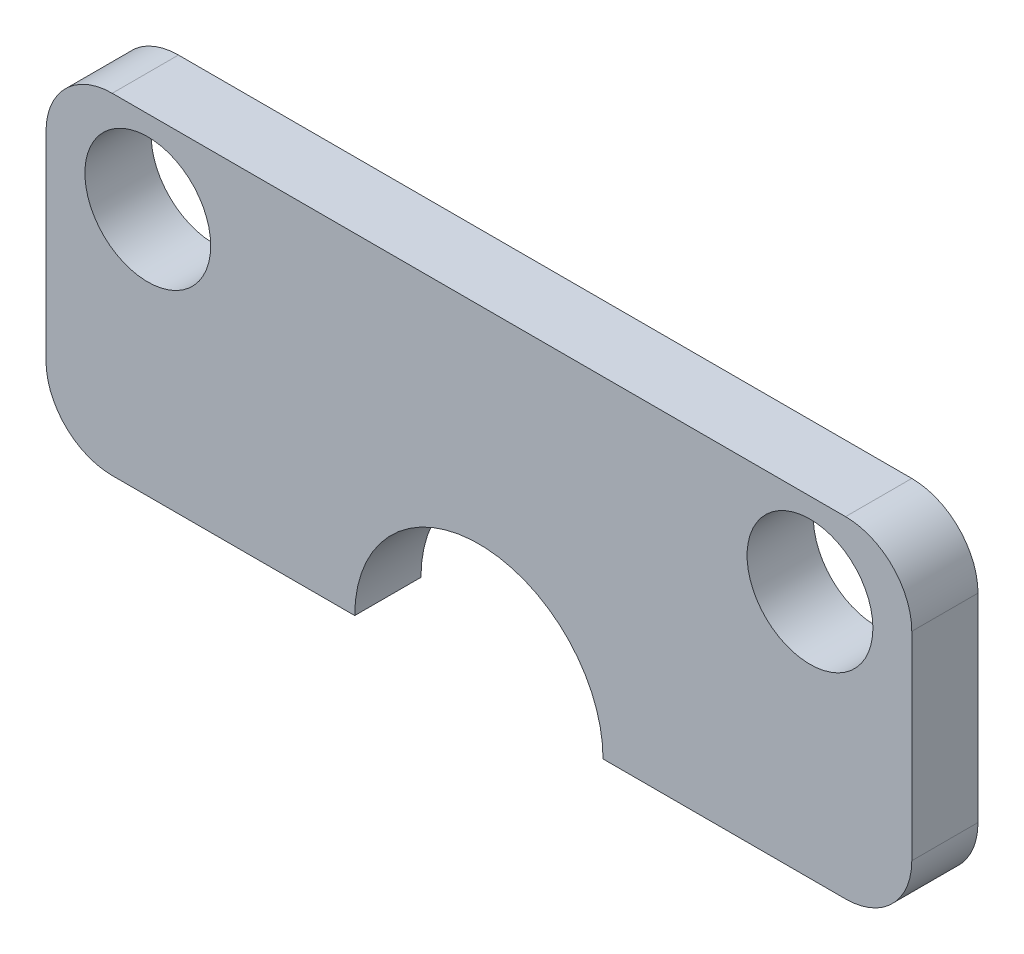
ISO-10303-21;
HEADER;
FILE_DESCRIPTION(('STEP AP214'),'2;1');
FILE_NAME('part.step','',(''),(''),'','','');
FILE_SCHEMA(('AUTOMOTIVE_DESIGN { 1 0 10303 214 1 1 1 1 }'));
ENDSEC;
DATA;
#1=APPLICATION_CONTEXT('core data for automotive mechanical design processes');
#2=APPLICATION_PROTOCOL_DEFINITION('international standard','automotive_design',2000,#1);
#3=PRODUCT_CONTEXT('',#1,'mechanical');
#4=PRODUCT('Part','Part','',(#3));
#5=PRODUCT_RELATED_PRODUCT_CATEGORY('part','',(#4));
#6=PRODUCT_DEFINITION_FORMATION('','',#4);
#7=PRODUCT_DEFINITION_CONTEXT('part definition',#1,'design');
#8=PRODUCT_DEFINITION('design','',#6,#7);
#9=PRODUCT_DEFINITION_SHAPE('','',#8);
#10=(LENGTH_UNIT() NAMED_UNIT(*) SI_UNIT(.MILLI.,.METRE.));
#11=(NAMED_UNIT(*) PLANE_ANGLE_UNIT() SI_UNIT($,.RADIAN.));
#12=(NAMED_UNIT(*) SI_UNIT($,.STERADIAN.) SOLID_ANGLE_UNIT());
#13=UNCERTAINTY_MEASURE_WITH_UNIT(LENGTH_MEASURE(1.E-05),#10,'distance_accuracy_value','');
#14=(GEOMETRIC_REPRESENTATION_CONTEXT(3) GLOBAL_UNCERTAINTY_ASSIGNED_CONTEXT((#13)) GLOBAL_UNIT_ASSIGNED_CONTEXT((#10,
#11,#12)) REPRESENTATION_CONTEXT('',''));
#15=CARTESIAN_POINT('',(0.,0.,0.));
#16=DIRECTION('',(0.,0.,1.));
#17=DIRECTION('',(1.,0.,0.));
#18=AXIS2_PLACEMENT_3D('',#15,#16,#17);
#19=CARTESIAN_POINT('',(0.,162.140585858571,2.54));
#20=DIRECTION('',(0.,-1.,0.));
#21=DIRECTION('',(0.,0.,-1.));
#22=AXIS2_PLACEMENT_3D('',#19,#20,#21);
#23=PLANE('',#22);
#24=DIRECTION('',(-1.,0.,0.));
#25=VECTOR('',#24,1.);
#26=CARTESIAN_POINT('',(0.,162.140585858571,2.54));
#27=LINE('',#26,#25);
#28=CARTESIAN_POINT('',(-355.451577680834,162.140585858571,2.54));
#29=VERTEX_POINT('',#28);
#30=CARTESIAN_POINT('',(-364.753338714652,162.140585858571,2.54));
#31=VERTEX_POINT('',#30);
#32=EDGE_CURVE('E113',#29,#31,#27,.T.);
#33=ORIENTED_EDGE('',*,*,#32,.T.);
#34=DIRECTION('',(0.,0.,-1.));
#35=VECTOR('',#34,1.);
#36=CARTESIAN_POINT('',(-364.753338714652,162.140585858571,2.54));
#37=LINE('',#36,#35);
#38=CARTESIAN_POINT('',(-364.753338714652,162.140585858571,0.));
#39=VERTEX_POINT('',#38);
#40=EDGE_CURVE('E121',#31,#39,#37,.T.);
#41=ORIENTED_EDGE('',*,*,#40,.T.);
#42=DIRECTION('',(-1.,0.,0.));
#43=VECTOR('',#42,1.);
#44=CARTESIAN_POINT('',(0.,162.140585858571,0.));
#45=LINE('',#44,#43);
#46=CARTESIAN_POINT('',(-355.451577680834,162.140585858571,0.));
#47=VERTEX_POINT('',#46);
#48=EDGE_CURVE('E116',#47,#39,#45,.T.);
#49=ORIENTED_EDGE('',*,*,#48,.F.);
#50=DIRECTION('',(0.,0.,-1.));
#51=VECTOR('',#50,1.);
#52=CARTESIAN_POINT('',(-355.451577680834,162.140585858571,2.54));
#53=LINE('',#52,#51);
#54=EDGE_CURVE('E110',#29,#47,#53,.T.);
#55=ORIENTED_EDGE('',*,*,#54,.F.);
#56=EDGE_LOOP('',(#33,#41,#49,#55));
#57=FACE_BOUND('',#56,.T.);
#58=ADVANCED_FACE('F32',(#57),#23,.T.);
#59=CARTESIAN_POINT('',(-350.689077680834,162.140585858571,2.54));
#60=DIRECTION('',(0.,0.,-1.));
#61=DIRECTION('',(-1.,0.,0.));
#62=AXIS2_PLACEMENT_3D('',#59,#60,#61);
#63=CYLINDRICAL_SURFACE('',#62,4.76250000000001);
#64=CARTESIAN_POINT('',(-350.689077680834,162.140585858571,0.));
#65=DIRECTION('',(0.,0.,1.));
#66=DIRECTION('',(1.,0.,0.));
#67=AXIS2_PLACEMENT_3D('',#64,#65,#66);
#68=CIRCLE('',#67,4.76250000000001);
#69=CARTESIAN_POINT('',(-345.926577680834,162.140585858571,0.));
#70=VERTEX_POINT('',#69);
#71=EDGE_CURVE('E154',#70,#47,#68,.T.);
#72=ORIENTED_EDGE('',*,*,#71,.F.);
#73=DIRECTION('',(0.,0.,-1.));
#74=VECTOR('',#73,1.);
#75=CARTESIAN_POINT('',(-345.926577680834,162.140585858571,2.54));
#76=LINE('',#75,#74);
#77=CARTESIAN_POINT('',(-345.926577680834,162.140585858571,2.54));
#78=VERTEX_POINT('',#77);
#79=EDGE_CURVE('E122',#78,#70,#76,.T.);
#80=ORIENTED_EDGE('',*,*,#79,.F.);
#81=CARTESIAN_POINT('',(-350.689077680834,162.140585858571,2.54));
#82=DIRECTION('',(0.,0.,1.));
#83=DIRECTION('',(1.,0.,0.));
#84=AXIS2_PLACEMENT_3D('',#81,#82,#83);
#85=CIRCLE('',#84,4.76250000000001);
#86=EDGE_CURVE('E129',#78,#29,#85,.T.);
#87=ORIENTED_EDGE('',*,*,#86,.T.);
#88=ORIENTED_EDGE('',*,*,#54,.T.);
#89=EDGE_LOOP('',(#72,#80,#87,#88));
#90=FACE_BOUND('',#89,.T.);
#91=ADVANCED_FACE('F134',(#90),#63,.F.);
#92=CARTESIAN_POINT('',(0.,162.140585858571,2.54));
#93=DIRECTION('',(0.,1.,0.));
#94=DIRECTION('',(0.,0.,1.));
#95=AXIS2_PLACEMENT_3D('',#92,#93,#94);
#96=PLANE('',#95);
#97=DIRECTION('',(1.,0.,0.));
#98=VECTOR('',#97,1.);
#99=CARTESIAN_POINT('',(0.,162.140585858571,0.));
#100=LINE('',#99,#98);
#101=CARTESIAN_POINT('',(-336.624816647016,162.140585858571,0.));
#102=VERTEX_POINT('',#101);
#103=EDGE_CURVE('E156',#70,#102,#100,.T.);
#104=ORIENTED_EDGE('',*,*,#103,.T.);
#105=DIRECTION('',(0.,0.,-1.));
#106=VECTOR('',#105,1.);
#107=CARTESIAN_POINT('',(-336.624816647016,162.140585858571,2.54));
#108=LINE('',#107,#106);
#109=CARTESIAN_POINT('',(-336.624816647016,162.140585858571,2.54));
#110=VERTEX_POINT('',#109);
#111=EDGE_CURVE('E199',#102,#110,#108,.F.);
#112=ORIENTED_EDGE('',*,*,#111,.T.);
#113=DIRECTION('',(1.,0.,0.));
#114=VECTOR('',#113,1.);
#115=CARTESIAN_POINT('',(0.,162.140585858571,2.54));
#116=LINE('',#115,#114);
#117=EDGE_CURVE('E136',#78,#110,#116,.T.);
#118=ORIENTED_EDGE('',*,*,#117,.F.);
#119=ORIENTED_EDGE('',*,*,#79,.T.);
#120=EDGE_LOOP('',(#104,#112,#118,#119));
#121=FACE_BOUND('',#120,.T.);
#122=ADVANCED_FACE('F202',(#121),#96,.F.);
#123=CARTESIAN_POINT('',(-334.084816647016,0.,2.54));
#124=DIRECTION('',(-1.,0.,0.));
#125=DIRECTION('',(0.,0.,1.));
#126=AXIS2_PLACEMENT_3D('',#123,#124,#125);
#127=PLANE('',#126);
#128=DIRECTION('',(0.,1.,0.));
#129=VECTOR('',#128,1.);
#130=CARTESIAN_POINT('',(-334.084816647016,0.,2.54));
#131=LINE('',#130,#129);
#132=CARTESIAN_POINT('',(-334.084816647016,164.680585858571,2.54));
#133=VERTEX_POINT('',#132);
#134=CARTESIAN_POINT('',(-334.084816647016,172.300585858571,2.54));
#135=VERTEX_POINT('',#134);
#136=EDGE_CURVE('E138',#133,#135,#131,.T.);
#137=ORIENTED_EDGE('',*,*,#136,.F.);
#138=DIRECTION('',(0.,0.,-1.));
#139=VECTOR('',#138,1.);
#140=CARTESIAN_POINT('',(-334.084816647016,164.680585858571,2.54));
#141=LINE('',#140,#139);
#142=CARTESIAN_POINT('',(-334.084816647016,164.680585858571,0.));
#143=VERTEX_POINT('',#142);
#144=EDGE_CURVE('E196',#133,#143,#141,.T.);
#145=ORIENTED_EDGE('',*,*,#144,.T.);
#146=DIRECTION('',(0.,1.,0.));
#147=VECTOR('',#146,1.);
#148=CARTESIAN_POINT('',(-334.084816647016,0.,0.));
#149=LINE('',#148,#147);
#150=CARTESIAN_POINT('',(-334.084816647016,172.300585858571,0.));
#151=VERTEX_POINT('',#150);
#152=EDGE_CURVE('E159',#143,#151,#149,.T.);
#153=ORIENTED_EDGE('',*,*,#152,.T.);
#154=DIRECTION('',(0.,0.,-1.));
#155=VECTOR('',#154,1.);
#156=CARTESIAN_POINT('',(-334.084816647016,172.300585858571,2.54));
#157=LINE('',#156,#155);
#158=EDGE_CURVE('E194',#151,#135,#157,.F.);
#159=ORIENTED_EDGE('',*,*,#158,.T.);
#160=EDGE_LOOP('',(#137,#145,#153,#159));
#161=FACE_BOUND('',#160,.T.);
#162=ADVANCED_FACE('F211',(#161),#127,.F.);
#163=CARTESIAN_POINT('',(0.,174.840585858571,2.54));
#164=DIRECTION('',(0.,1.,0.));
#165=DIRECTION('',(0.,0.,1.));
#166=AXIS2_PLACEMENT_3D('',#163,#164,#165);
#167=PLANE('',#166);
#168=DIRECTION('',(1.,0.,0.));
#169=VECTOR('',#168,1.);
#170=CARTESIAN_POINT('',(0.,174.840585858571,2.54));
#171=LINE('',#170,#169);
#172=CARTESIAN_POINT('',(-364.753338714652,174.840585858571,2.54));
#173=VERTEX_POINT('',#172);
#174=CARTESIAN_POINT('',(-336.624816647016,174.840585858571,2.54));
#175=VERTEX_POINT('',#174);
#176=EDGE_CURVE('E142',#173,#175,#171,.T.);
#177=ORIENTED_EDGE('',*,*,#176,.T.);
#178=DIRECTION('',(0.,0.,-1.));
#179=VECTOR('',#178,1.);
#180=CARTESIAN_POINT('',(-336.624816647016,174.840585858571,0.));
#181=LINE('',#180,#179);
#182=CARTESIAN_POINT('',(-336.624816647016,174.840585858571,0.));
#183=VERTEX_POINT('',#182);
#184=EDGE_CURVE('E11',#175,#183,#181,.T.);
#185=ORIENTED_EDGE('',*,*,#184,.T.);
#186=DIRECTION('',(1.,0.,0.));
#187=VECTOR('',#186,1.);
#188=CARTESIAN_POINT('',(0.,174.840585858571,0.));
#189=LINE('',#188,#187);
#190=CARTESIAN_POINT('',(-364.753338714652,174.840585858571,0.));
#191=VERTEX_POINT('',#190);
#192=EDGE_CURVE('E162',#191,#183,#189,.T.);
#193=ORIENTED_EDGE('',*,*,#192,.F.);
#194=DIRECTION('',(0.,0.,-1.));
#195=VECTOR('',#194,1.);
#196=CARTESIAN_POINT('',(-364.753338714652,174.840585858571,2.54));
#197=LINE('',#196,#195);
#198=EDGE_CURVE('E40',#191,#173,#197,.F.);
#199=ORIENTED_EDGE('',*,*,#198,.T.);
#200=EDGE_LOOP('',(#177,#185,#193,#199));
#201=FACE_BOUND('',#200,.T.);
#202=ADVANCED_FACE('F219',(#201),#167,.T.);
#203=CARTESIAN_POINT('',(-363.389077680824,171.665585858591,2.54));
#204=DIRECTION('',(0.,0.,-1.));
#205=DIRECTION('',(-1.,0.,0.));
#206=AXIS2_PLACEMENT_3D('',#203,#204,#205);
#207=CYLINDRICAL_SURFACE('',#206,2.413);
#208=CARTESIAN_POINT('',(-363.389077680824,171.665585858591,2.54));
#209=DIRECTION('',(0.,0.,1.));
#210=DIRECTION('',(1.,0.,0.));
#211=AXIS2_PLACEMENT_3D('',#208,#209,#210);
#212=CIRCLE('',#211,2.413);
#213=CARTESIAN_POINT('',(-360.976077680824,171.665585858591,2.54));
#214=VERTEX_POINT('',#213);
#215=EDGE_CURVE('E147',#214,#214,#212,.T.);
#216=ORIENTED_EDGE('',*,*,#215,.T.);
#217=EDGE_LOOP('',(#216));
#218=FACE_BOUND('',#217,.T.);
#219=CARTESIAN_POINT('',(-363.389077680824,171.665585858591,0.));
#220=DIRECTION('',(0.,0.,1.));
#221=DIRECTION('',(1.,0.,0.));
#222=AXIS2_PLACEMENT_3D('',#219,#220,#221);
#223=CIRCLE('',#222,2.413);
#224=CARTESIAN_POINT('',(-360.976077680824,171.665585858591,0.));
#225=VERTEX_POINT('',#224);
#226=EDGE_CURVE('E168',#225,#225,#223,.T.);
#227=ORIENTED_EDGE('',*,*,#226,.F.);
#228=EDGE_LOOP('',(#227));
#229=FACE_BOUND('',#228,.T.);
#230=ADVANCED_FACE('F250',(#218,#229),#207,.F.);
#231=CARTESIAN_POINT('',(-367.293338714652,0.,2.54));
#232=DIRECTION('',(-1.,0.,0.));
#233=DIRECTION('',(0.,0.,1.));
#234=AXIS2_PLACEMENT_3D('',#231,#232,#233);
#235=PLANE('',#234);
#236=DIRECTION('',(0.,1.,0.));
#237=VECTOR('',#236,1.);
#238=CARTESIAN_POINT('',(-367.293338714652,0.,0.));
#239=LINE('',#238,#237);
#240=CARTESIAN_POINT('',(-367.293338714652,164.680585858571,0.));
#241=VERTEX_POINT('',#240);
#242=CARTESIAN_POINT('',(-367.293338714652,172.300585858571,0.));
#243=VERTEX_POINT('',#242);
#244=EDGE_CURVE('E165',#241,#243,#239,.T.);
#245=ORIENTED_EDGE('',*,*,#244,.F.);
#246=DIRECTION('',(0.,0.,-1.));
#247=VECTOR('',#246,1.);
#248=CARTESIAN_POINT('',(-367.293338714652,164.680585858571,2.54));
#249=LINE('',#248,#247);
#250=CARTESIAN_POINT('',(-367.293338714652,164.680585858571,2.54));
#251=VERTEX_POINT('',#250);
#252=EDGE_CURVE('E186',#241,#251,#249,.F.);
#253=ORIENTED_EDGE('',*,*,#252,.T.);
#254=DIRECTION('',(0.,1.,0.));
#255=VECTOR('',#254,1.);
#256=CARTESIAN_POINT('',(-367.293338714652,0.,2.54));
#257=LINE('',#256,#255);
#258=CARTESIAN_POINT('',(-367.293338714652,172.300585858571,2.54));
#259=VERTEX_POINT('',#258);
#260=EDGE_CURVE('E144',#251,#259,#257,.T.);
#261=ORIENTED_EDGE('',*,*,#260,.T.);
#262=DIRECTION('',(0.,0.,-1.));
#263=VECTOR('',#262,1.);
#264=CARTESIAN_POINT('',(-367.293338714652,172.300585858571,2.54));
#265=LINE('',#264,#263);
#266=EDGE_CURVE('E183',#259,#243,#265,.T.);
#267=ORIENTED_EDGE('',*,*,#266,.T.);
#268=EDGE_LOOP('',(#245,#253,#261,#267));
#269=FACE_BOUND('',#268,.T.);
#270=ADVANCED_FACE('F225',(#269),#235,.T.);
#271=CARTESIAN_POINT('',(-337.989077680824,171.665585858591,2.54));
#272=DIRECTION('',(0.,0.,-1.));
#273=DIRECTION('',(-1.,0.,0.));
#274=AXIS2_PLACEMENT_3D('',#271,#272,#273);
#275=CYLINDRICAL_SURFACE('',#274,2.413);
#276=CARTESIAN_POINT('',(-337.989077680824,171.665585858591,2.54));
#277=DIRECTION('',(0.,0.,1.));
#278=DIRECTION('',(1.,0.,0.));
#279=AXIS2_PLACEMENT_3D('',#276,#277,#278);
#280=CIRCLE('',#279,2.413);
#281=CARTESIAN_POINT('',(-335.576077680824,171.665585858591,2.54));
#282=VERTEX_POINT('',#281);
#283=EDGE_CURVE('E150',#282,#282,#280,.T.);
#284=ORIENTED_EDGE('',*,*,#283,.T.);
#285=EDGE_LOOP('',(#284));
#286=FACE_BOUND('',#285,.T.);
#287=CARTESIAN_POINT('',(-337.989077680824,171.665585858591,0.));
#288=DIRECTION('',(0.,0.,1.));
#289=DIRECTION('',(1.,0.,0.));
#290=AXIS2_PLACEMENT_3D('',#287,#288,#289);
#291=CIRCLE('',#290,2.413);
#292=CARTESIAN_POINT('',(-335.576077680824,171.665585858591,0.));
#293=VERTEX_POINT('',#292);
#294=EDGE_CURVE('E132',#293,#293,#291,.T.);
#295=ORIENTED_EDGE('',*,*,#294,.F.);
#296=EDGE_LOOP('',(#295));
#297=FACE_BOUND('',#296,.T.);
#298=ADVANCED_FACE('F253',(#286,#297),#275,.F.);
#299=CARTESIAN_POINT('',(0.,0.,2.54));
#300=DIRECTION('',(0.,0.,1.));
#301=DIRECTION('',(1.,0.,0.));
#302=AXIS2_PLACEMENT_3D('',#299,#300,#301);
#303=PLANE('',#302);
#304=ORIENTED_EDGE('',*,*,#260,.F.);
#305=CARTESIAN_POINT('',(-364.753338714652,164.680585858571,2.54));
#306=DIRECTION('',(0.,0.,1.));
#307=DIRECTION('',(1.,0.,0.));
#308=AXIS2_PLACEMENT_3D('',#305,#306,#307);
#309=CIRCLE('',#308,2.54);
#310=EDGE_CURVE('E131',#251,#31,#309,.T.);
#311=ORIENTED_EDGE('',*,*,#310,.T.);
#312=ORIENTED_EDGE('',*,*,#32,.F.);
#313=ORIENTED_EDGE('',*,*,#86,.F.);
#314=ORIENTED_EDGE('',*,*,#117,.T.);
#315=CARTESIAN_POINT('',(-336.624816647016,164.680585858571,2.54));
#316=DIRECTION('',(0.,0.,1.));
#317=DIRECTION('',(1.,0.,0.));
#318=AXIS2_PLACEMENT_3D('',#315,#316,#317);
#319=CIRCLE('',#318,2.54);
#320=EDGE_CURVE('E191',#110,#133,#319,.T.);
#321=ORIENTED_EDGE('',*,*,#320,.T.);
#322=ORIENTED_EDGE('',*,*,#136,.T.);
#323=CARTESIAN_POINT('',(-336.624816647016,172.300585858571,2.54));
#324=DIRECTION('',(0.,0.,1.));
#325=DIRECTION('',(1.,0.,0.));
#326=AXIS2_PLACEMENT_3D('',#323,#324,#325);
#327=CIRCLE('',#326,2.54);
#328=EDGE_CURVE('E47',#135,#175,#327,.T.);
#329=ORIENTED_EDGE('',*,*,#328,.T.);
#330=ORIENTED_EDGE('',*,*,#176,.F.);
#331=CARTESIAN_POINT('',(-364.753338714652,172.300585858571,2.54));
#332=DIRECTION('',(0.,0.,1.));
#333=DIRECTION('',(1.,0.,0.));
#334=AXIS2_PLACEMENT_3D('',#331,#332,#333);
#335=CIRCLE('',#334,2.54);
#336=EDGE_CURVE('E188',#173,#259,#335,.T.);
#337=ORIENTED_EDGE('',*,*,#336,.T.);
#338=EDGE_LOOP('',(#304,#311,#312,#313,#314,#321,#322,#329,#330,#337));
#339=FACE_BOUND('',#338,.T.);
#340=ORIENTED_EDGE('',*,*,#215,.F.);
#341=EDGE_LOOP('',(#340));
#342=FACE_BOUND('',#341,.T.);
#343=ORIENTED_EDGE('',*,*,#283,.F.);
#344=EDGE_LOOP('',(#343));
#345=FACE_BOUND('',#344,.T.);
#346=ADVANCED_FACE('F126',(#339,#342,#345),#303,.T.);
#347=CARTESIAN_POINT('',(0.,0.,0.));
#348=DIRECTION('',(0.,0.,1.));
#349=DIRECTION('',(1.,0.,0.));
#350=AXIS2_PLACEMENT_3D('',#347,#348,#349);
#351=PLANE('',#350);
#352=ORIENTED_EDGE('',*,*,#48,.T.);
#353=CARTESIAN_POINT('',(-364.753338714652,164.680585858571,0.));
#354=DIRECTION('',(0.,0.,1.));
#355=DIRECTION('',(1.,0.,0.));
#356=AXIS2_PLACEMENT_3D('',#353,#354,#355);
#357=CIRCLE('',#356,2.54);
#358=EDGE_CURVE('E181',#39,#241,#357,.F.);
#359=ORIENTED_EDGE('',*,*,#358,.T.);
#360=ORIENTED_EDGE('',*,*,#244,.T.);
#361=CARTESIAN_POINT('',(-364.753338714652,172.300585858571,0.));
#362=DIRECTION('',(0.,0.,1.));
#363=DIRECTION('',(1.,0.,0.));
#364=AXIS2_PLACEMENT_3D('',#361,#362,#363);
#365=CIRCLE('',#364,2.54);
#366=EDGE_CURVE('E175',#243,#191,#365,.F.);
#367=ORIENTED_EDGE('',*,*,#366,.T.);
#368=ORIENTED_EDGE('',*,*,#192,.T.);
#369=CARTESIAN_POINT('',(-336.624816647016,172.300585858571,0.));
#370=DIRECTION('',(0.,0.,1.));
#371=DIRECTION('',(1.,0.,0.));
#372=AXIS2_PLACEMENT_3D('',#369,#370,#371);
#373=CIRCLE('',#372,2.54);
#374=EDGE_CURVE('E177',#183,#151,#373,.F.);
#375=ORIENTED_EDGE('',*,*,#374,.T.);
#376=ORIENTED_EDGE('',*,*,#152,.F.);
#377=CARTESIAN_POINT('',(-336.624816647016,164.680585858571,0.));
#378=DIRECTION('',(0.,0.,1.));
#379=DIRECTION('',(1.,0.,0.));
#380=AXIS2_PLACEMENT_3D('',#377,#378,#379);
#381=CIRCLE('',#380,2.54);
#382=EDGE_CURVE('E179',#143,#102,#381,.F.);
#383=ORIENTED_EDGE('',*,*,#382,.T.);
#384=ORIENTED_EDGE('',*,*,#103,.F.);
#385=ORIENTED_EDGE('',*,*,#71,.T.);
#386=EDGE_LOOP('',(#352,#359,#360,#367,#368,#375,#376,#383,#384,#385));
#387=FACE_BOUND('',#386,.T.);
#388=ORIENTED_EDGE('',*,*,#226,.T.);
#389=EDGE_LOOP('',(#388));
#390=FACE_BOUND('',#389,.T.);
#391=ORIENTED_EDGE('',*,*,#294,.T.);
#392=EDGE_LOOP('',(#391));
#393=FACE_BOUND('',#392,.T.);
#394=ADVANCED_FACE('F214',(#387,#390,#393),#351,.F.);
#395=CARTESIAN_POINT('',(-364.753338714652,164.680585858571,2.54));
#396=DIRECTION('',(0.,0.,-1.));
#397=DIRECTION('',(-1.,0.,0.));
#398=AXIS2_PLACEMENT_3D('',#395,#396,#397);
#399=CYLINDRICAL_SURFACE('',#398,2.54);
#400=ORIENTED_EDGE('',*,*,#310,.F.);
#401=ORIENTED_EDGE('',*,*,#252,.F.);
#402=ORIENTED_EDGE('',*,*,#358,.F.);
#403=ORIENTED_EDGE('',*,*,#40,.F.);
#404=EDGE_LOOP('',(#400,#401,#402,#403));
#405=FACE_BOUND('',#404,.T.);
#406=ADVANCED_FACE('F228',(#405),#399,.T.);
#407=CARTESIAN_POINT('',(-336.624816647016,164.680585858571,2.54));
#408=DIRECTION('',(0.,0.,-1.));
#409=DIRECTION('',(-1.,0.,0.));
#410=AXIS2_PLACEMENT_3D('',#407,#408,#409);
#411=CYLINDRICAL_SURFACE('',#410,2.54);
#412=ORIENTED_EDGE('',*,*,#320,.F.);
#413=ORIENTED_EDGE('',*,*,#111,.F.);
#414=ORIENTED_EDGE('',*,*,#382,.F.);
#415=ORIENTED_EDGE('',*,*,#144,.F.);
#416=EDGE_LOOP('',(#412,#413,#414,#415));
#417=FACE_BOUND('',#416,.T.);
#418=ADVANCED_FACE('F208',(#417),#411,.T.);
#419=CARTESIAN_POINT('',(-336.624816647016,172.300585858571,2.54));
#420=DIRECTION('',(0.,0.,1.));
#421=DIRECTION('',(1.,0.,0.));
#422=AXIS2_PLACEMENT_3D('',#419,#420,#421);
#423=CYLINDRICAL_SURFACE('',#422,2.54);
#424=ORIENTED_EDGE('',*,*,#328,.F.);
#425=ORIENTED_EDGE('',*,*,#158,.F.);
#426=ORIENTED_EDGE('',*,*,#374,.F.);
#427=ORIENTED_EDGE('',*,*,#184,.F.);
#428=EDGE_LOOP('',(#424,#425,#426,#427));
#429=FACE_BOUND('',#428,.T.);
#430=ADVANCED_FACE('F218',(#429),#423,.T.);
#431=CARTESIAN_POINT('',(-364.753338714652,172.300585858571,2.54));
#432=DIRECTION('',(0.,0.,-1.));
#433=DIRECTION('',(-1.,0.,0.));
#434=AXIS2_PLACEMENT_3D('',#431,#432,#433);
#435=CYLINDRICAL_SURFACE('',#434,2.54);
#436=ORIENTED_EDGE('',*,*,#336,.F.);
#437=ORIENTED_EDGE('',*,*,#198,.F.);
#438=ORIENTED_EDGE('',*,*,#366,.F.);
#439=ORIENTED_EDGE('',*,*,#266,.F.);
#440=EDGE_LOOP('',(#436,#437,#438,#439));
#441=FACE_BOUND('',#440,.T.);
#442=ADVANCED_FACE('F34',(#441),#435,.T.);
#443=CLOSED_SHELL('',(#58,#91,#122,#162,#202,#230,#270,#298,#346,#394,#406,#418,#430,#442));
#444=MANIFOLD_SOLID_BREP('B2',#443);
#445=ADVANCED_BREP_SHAPE_REPRESENTATION('',(#18,#444),#14);
#446=SHAPE_DEFINITION_REPRESENTATION(#9,#445);
ENDSEC;
END-ISO-10303-21;
